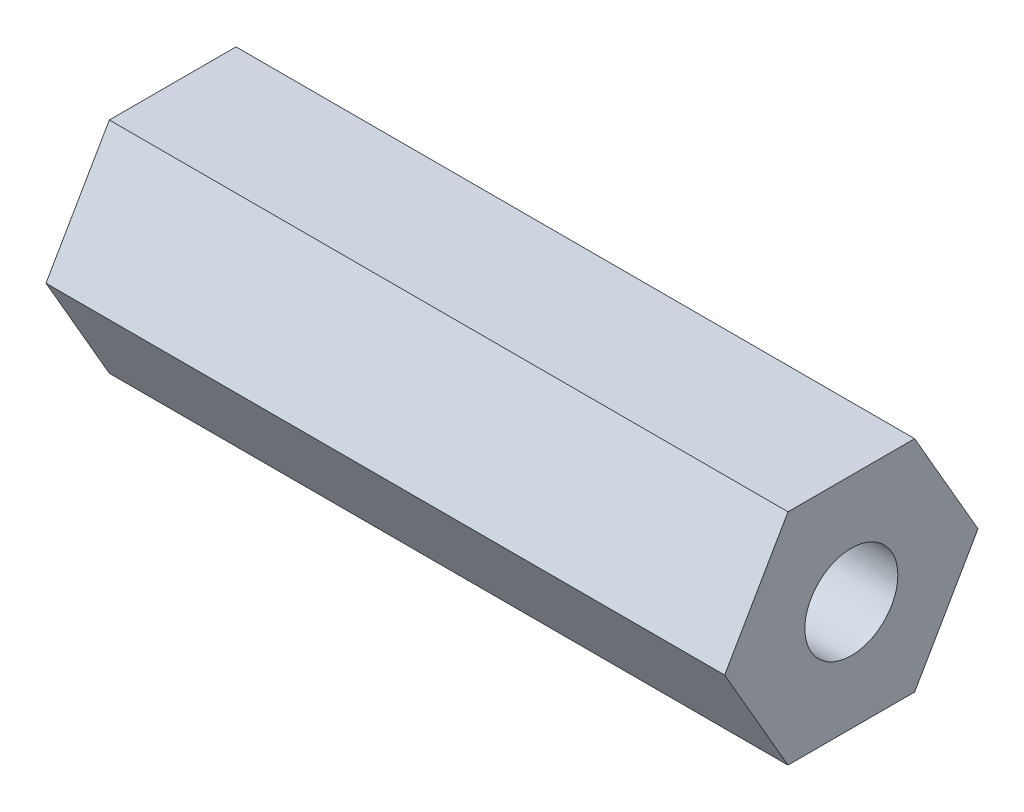
ISO-10303-21;
HEADER;
FILE_DESCRIPTION(('STEP AP214'),'2;1');
FILE_NAME('part.step','',(''),(''),'','','');
FILE_SCHEMA(('AUTOMOTIVE_DESIGN { 1 0 10303 214 1 1 1 1 }'));
ENDSEC;
DATA;
#1=APPLICATION_CONTEXT('core data for automotive mechanical design processes');
#2=APPLICATION_PROTOCOL_DEFINITION('international standard','automotive_design',2000,#1);
#3=PRODUCT_CONTEXT('',#1,'mechanical');
#4=PRODUCT('Part','Part','',(#3));
#5=PRODUCT_RELATED_PRODUCT_CATEGORY('part','',(#4));
#6=PRODUCT_DEFINITION_FORMATION('','',#4);
#7=PRODUCT_DEFINITION_CONTEXT('part definition',#1,'design');
#8=PRODUCT_DEFINITION('design','',#6,#7);
#9=PRODUCT_DEFINITION_SHAPE('','',#8);
#10=(LENGTH_UNIT() NAMED_UNIT(*) SI_UNIT(.MILLI.,.METRE.));
#11=(NAMED_UNIT(*) PLANE_ANGLE_UNIT() SI_UNIT($,.RADIAN.));
#12=(NAMED_UNIT(*) SI_UNIT($,.STERADIAN.) SOLID_ANGLE_UNIT());
#13=UNCERTAINTY_MEASURE_WITH_UNIT(LENGTH_MEASURE(1.E-05),#10,'distance_accuracy_value','');
#14=(GEOMETRIC_REPRESENTATION_CONTEXT(3) GLOBAL_UNCERTAINTY_ASSIGNED_CONTEXT((#13)) GLOBAL_UNIT_ASSIGNED_CONTEXT((#10,
#11,#12)) REPRESENTATION_CONTEXT('',''));
#15=CARTESIAN_POINT('',(0.,0.,0.));
#16=DIRECTION('',(0.,0.,1.));
#17=DIRECTION('',(1.,0.,0.));
#18=AXIS2_PLACEMENT_3D('',#15,#16,#17);
#19=CARTESIAN_POINT('',(38.1,0.,0.));
#20=DIRECTION('',(1.,0.,0.));
#21=DIRECTION('',(0.,1.,0.));
#22=AXIS2_PLACEMENT_3D('',#19,#20,#21);
#23=PLANE('',#22);
#24=CARTESIAN_POINT('',(38.1,0.,0.));
#25=DIRECTION('',(1.,0.,0.));
#26=DIRECTION('',(0.,0.,-1.));
#27=AXIS2_PLACEMENT_3D('',#24,#25,#26);
#28=CIRCLE('',#27,2.0193);
#29=CARTESIAN_POINT('',(38.1,0.,-2.0193));
#30=VERTEX_POINT('',#29);
#31=EDGE_CURVE('E129',#30,#30,#28,.T.);
#32=ORIENTED_EDGE('',*,*,#31,.F.);
#33=EDGE_LOOP('',(#32));
#34=FACE_BOUND('',#33,.T.);
#35=DIRECTION('',(0.,0.866025403784442,-0.5));
#36=VECTOR('',#35,1.);
#37=CARTESIAN_POINT('',(38.1,-4.7625,-2.74963065701564));
#38=LINE('',#37,#36);
#39=CARTESIAN_POINT('',(38.1,-4.7625,-2.74963065701564));
#40=VERTEX_POINT('',#39);
#41=CARTESIAN_POINT('',(38.1,0.,-5.49926131403117));
#42=VERTEX_POINT('',#41);
#43=EDGE_CURVE('E154',#40,#42,#38,.T.);
#44=ORIENTED_EDGE('',*,*,#43,.T.);
#45=DIRECTION('',(0.,0.866025403784438,0.5));
#46=VECTOR('',#45,1.);
#47=CARTESIAN_POINT('',(38.1,0.,-5.49926131403117));
#48=LINE('',#47,#46);
#49=CARTESIAN_POINT('',(38.1,4.7625,-2.74963065701557));
#50=VERTEX_POINT('',#49);
#51=EDGE_CURVE('E102',#42,#50,#48,.T.);
#52=ORIENTED_EDGE('',*,*,#51,.T.);
#53=DIRECTION('',(0.,0.,1.));
#54=VECTOR('',#53,1.);
#55=CARTESIAN_POINT('',(38.1,4.7625,-2.74963065701557));
#56=LINE('',#55,#54);
#57=CARTESIAN_POINT('',(38.1,4.7625,2.7496306570156));
#58=VERTEX_POINT('',#57);
#59=EDGE_CURVE('E143',#50,#58,#56,.T.);
#60=ORIENTED_EDGE('',*,*,#59,.T.);
#61=DIRECTION('',(0.,-0.866025403784442,0.5));
#62=VECTOR('',#61,1.);
#63=CARTESIAN_POINT('',(38.1,4.7625,2.7496306570156));
#64=LINE('',#63,#62);
#65=CARTESIAN_POINT('',(38.1,0.,5.49926131403117));
#66=VERTEX_POINT('',#65);
#67=EDGE_CURVE('E142',#58,#66,#64,.T.);
#68=ORIENTED_EDGE('',*,*,#67,.T.);
#69=DIRECTION('',(0.,-0.866025403784435,-0.500000000000007));
#70=VECTOR('',#69,1.);
#71=CARTESIAN_POINT('',(38.1,0.,5.49926131403117));
#72=LINE('',#71,#70);
#73=CARTESIAN_POINT('',(38.1,-4.7625,2.74963065701554));
#74=VERTEX_POINT('',#73);
#75=EDGE_CURVE('E55',#66,#74,#72,.T.);
#76=ORIENTED_EDGE('',*,*,#75,.T.);
#77=DIRECTION('',(0.,0.,-1.));
#78=VECTOR('',#77,1.);
#79=CARTESIAN_POINT('',(38.1,-4.7625,2.74963065701554));
#80=LINE('',#79,#78);
#81=EDGE_CURVE('E11',#74,#40,#80,.T.);
#82=ORIENTED_EDGE('',*,*,#81,.T.);
#83=EDGE_LOOP('',(#44,#52,#60,#68,#76,#82));
#84=FACE_BOUND('',#83,.T.);
#85=ADVANCED_FACE('F45',(#34,#84),#23,.T.);
#86=CARTESIAN_POINT('',(38.1,-4.7625,2.74963065701554));
#87=DIRECTION('',(0.,1.,0.));
#88=DIRECTION('',(0.,0.,-1.));
#89=AXIS2_PLACEMENT_3D('',#86,#87,#88);
#90=PLANE('',#89);
#91=DIRECTION('',(-1.,0.,0.));
#92=VECTOR('',#91,1.);
#93=CARTESIAN_POINT('',(38.1,-4.7625,2.74963065701554));
#94=LINE('',#93,#92);
#95=CARTESIAN_POINT('',(8.636,-4.76249999999999,2.74963065701555));
#96=VERTEX_POINT('',#95);
#97=EDGE_CURVE('E148',#74,#96,#94,.T.);
#98=ORIENTED_EDGE('',*,*,#97,.T.);
#99=DIRECTION('',(0.,0.,-1.));
#100=VECTOR('',#99,1.);
#101=CARTESIAN_POINT('',(8.636,-4.7625,2.74963065701554));
#102=LINE('',#101,#100);
#103=CARTESIAN_POINT('',(8.636,-4.7625,-2.74963065701564));
#104=VERTEX_POINT('',#103);
#105=EDGE_CURVE('E124',#96,#104,#102,.T.);
#106=ORIENTED_EDGE('',*,*,#105,.T.);
#107=DIRECTION('',(-1.,0.,0.));
#108=VECTOR('',#107,1.);
#109=CARTESIAN_POINT('',(38.1,-4.7625,-2.74963065701564));
#110=LINE('',#109,#108);
#111=EDGE_CURVE('E157',#40,#104,#110,.T.);
#112=ORIENTED_EDGE('',*,*,#111,.F.);
#113=ORIENTED_EDGE('',*,*,#81,.F.);
#114=EDGE_LOOP('',(#98,#106,#112,#113));
#115=FACE_BOUND('',#114,.T.);
#116=ADVANCED_FACE('F178',(#115),#90,.F.);
#117=CARTESIAN_POINT('',(38.1,0.,5.49926131403117));
#118=DIRECTION('',(0.,0.500000000000007,-0.866025403784435));
#119=DIRECTION('',(-1.,0.,0.));
#120=AXIS2_PLACEMENT_3D('',#117,#118,#119);
#121=PLANE('',#120);
#122=DIRECTION('',(-1.,0.,0.));
#123=VECTOR('',#122,1.);
#124=CARTESIAN_POINT('',(38.1,0.,5.49926131403117));
#125=LINE('',#124,#123);
#126=CARTESIAN_POINT('',(8.636,0.,5.49926131403121));
#127=VERTEX_POINT('',#126);
#128=EDGE_CURVE('E135',#66,#127,#125,.T.);
#129=ORIENTED_EDGE('',*,*,#128,.T.);
#130=DIRECTION('',(0.,-0.866025403784435,-0.500000000000007));
#131=VECTOR('',#130,1.);
#132=CARTESIAN_POINT('',(8.636,0.,5.49926131403117));
#133=LINE('',#132,#131);
#134=EDGE_CURVE('E118',#127,#96,#133,.T.);
#135=ORIENTED_EDGE('',*,*,#134,.T.);
#136=ORIENTED_EDGE('',*,*,#97,.F.);
#137=ORIENTED_EDGE('',*,*,#75,.F.);
#138=EDGE_LOOP('',(#129,#135,#136,#137));
#139=FACE_BOUND('',#138,.T.);
#140=ADVANCED_FACE('F47',(#139),#121,.F.);
#141=CARTESIAN_POINT('',(38.1,4.7625,2.7496306570156));
#142=DIRECTION('',(0.,-0.5,-0.866025403784442));
#143=DIRECTION('',(0.,-0.866025403784442,0.5));
#144=AXIS2_PLACEMENT_3D('',#141,#142,#143);
#145=PLANE('',#144);
#146=DIRECTION('',(-1.,0.,0.));
#147=VECTOR('',#146,1.);
#148=CARTESIAN_POINT('',(38.1,4.7625,2.7496306570156));
#149=LINE('',#148,#147);
#150=CARTESIAN_POINT('',(8.636,4.76249999999998,2.74963065701562));
#151=VERTEX_POINT('',#150);
#152=EDGE_CURVE('E137',#58,#151,#149,.T.);
#153=ORIENTED_EDGE('',*,*,#152,.T.);
#154=DIRECTION('',(0.,0.866025403784439,-0.499999999999998));
#155=VECTOR('',#154,1.);
#156=CARTESIAN_POINT('',(8.636,7.14374999999999,1.37481532850782));
#157=LINE('',#156,#155);
#158=EDGE_CURVE('E121',#127,#151,#157,.T.);
#159=ORIENTED_EDGE('',*,*,#158,.F.);
#160=ORIENTED_EDGE('',*,*,#128,.F.);
#161=ORIENTED_EDGE('',*,*,#67,.F.);
#162=EDGE_LOOP('',(#153,#159,#160,#161));
#163=FACE_BOUND('',#162,.T.);
#164=ADVANCED_FACE('F134',(#163),#145,.F.);
#165=CARTESIAN_POINT('',(38.1,4.7625,-2.74963065701557));
#166=DIRECTION('',(0.,-1.,0.));
#167=DIRECTION('',(0.,0.,-1.));
#168=AXIS2_PLACEMENT_3D('',#165,#166,#167);
#169=PLANE('',#168);
#170=DIRECTION('',(-1.,0.,0.));
#171=VECTOR('',#170,1.);
#172=CARTESIAN_POINT('',(38.1,4.7625,-2.74963065701557));
#173=LINE('',#172,#171);
#174=CARTESIAN_POINT('',(8.636,4.7625,-2.74963065701558));
#175=VERTEX_POINT('',#174);
#176=EDGE_CURVE('E173',#50,#175,#173,.T.);
#177=ORIENTED_EDGE('',*,*,#176,.T.);
#178=DIRECTION('',(0.,0.,1.));
#179=VECTOR('',#178,1.);
#180=CARTESIAN_POINT('',(8.636,4.7625,-2.74963065701557));
#181=LINE('',#180,#179);
#182=EDGE_CURVE('E182',#175,#151,#181,.T.);
#183=ORIENTED_EDGE('',*,*,#182,.T.);
#184=ORIENTED_EDGE('',*,*,#152,.F.);
#185=ORIENTED_EDGE('',*,*,#59,.F.);
#186=EDGE_LOOP('',(#177,#183,#184,#185));
#187=FACE_BOUND('',#186,.T.);
#188=ADVANCED_FACE('F228',(#187),#169,.F.);
#189=CARTESIAN_POINT('',(38.1,0.,-5.49926131403117));
#190=DIRECTION('',(0.,-0.5,0.866025403784438));
#191=DIRECTION('',(-1.,0.,0.));
#192=AXIS2_PLACEMENT_3D('',#189,#190,#191);
#193=PLANE('',#192);
#194=DIRECTION('',(-1.,0.,0.));
#195=VECTOR('',#194,1.);
#196=CARTESIAN_POINT('',(38.1,0.,-5.49926131403117));
#197=LINE('',#196,#195);
#198=CARTESIAN_POINT('',(8.636,0.,-5.49926131403117));
#199=VERTEX_POINT('',#198);
#200=EDGE_CURVE('E158',#42,#199,#197,.T.);
#201=ORIENTED_EDGE('',*,*,#200,.T.);
#202=DIRECTION('',(0.,0.866025403784438,0.5));
#203=VECTOR('',#202,1.);
#204=CARTESIAN_POINT('',(8.636,0.,-5.49926131403117));
#205=LINE('',#204,#203);
#206=EDGE_CURVE('E63',#199,#175,#205,.T.);
#207=ORIENTED_EDGE('',*,*,#206,.T.);
#208=ORIENTED_EDGE('',*,*,#176,.F.);
#209=ORIENTED_EDGE('',*,*,#51,.F.);
#210=EDGE_LOOP('',(#201,#207,#208,#209));
#211=FACE_BOUND('',#210,.T.);
#212=ADVANCED_FACE('F260',(#211),#193,.F.);
#213=CARTESIAN_POINT('',(38.1,-4.7625,-2.74963065701564));
#214=DIRECTION('',(0.,0.5,0.866025403784442));
#215=DIRECTION('',(1.,0.,0.));
#216=AXIS2_PLACEMENT_3D('',#213,#214,#215);
#217=PLANE('',#216);
#218=ORIENTED_EDGE('',*,*,#111,.T.);
#219=DIRECTION('',(0.,0.866025403784439,-0.499999999999999));
#220=VECTOR('',#219,1.);
#221=CARTESIAN_POINT('',(8.636,-4.7625,-2.74963065701564));
#222=LINE('',#221,#220);
#223=EDGE_CURVE('E186',#104,#199,#222,.T.);
#224=ORIENTED_EDGE('',*,*,#223,.T.);
#225=ORIENTED_EDGE('',*,*,#200,.F.);
#226=ORIENTED_EDGE('',*,*,#43,.F.);
#227=EDGE_LOOP('',(#218,#224,#225,#226));
#228=FACE_BOUND('',#227,.T.);
#229=ADVANCED_FACE('F185',(#228),#217,.F.);
#230=CARTESIAN_POINT('',(-38.1,0.,0.));
#231=DIRECTION('',(-1.,0.,0.));
#232=DIRECTION('',(0.,0.,1.));
#233=AXIS2_PLACEMENT_3D('',#230,#231,#232);
#234=CYLINDRICAL_SURFACE('',#233,2.0193);
#235=CARTESIAN_POINT('',(8.636,0.,0.));
#236=DIRECTION('',(1.,0.,0.));
#237=DIRECTION('',(0.,0.,-1.));
#238=AXIS2_PLACEMENT_3D('',#235,#236,#237);
#239=CIRCLE('',#238,2.0193);
#240=CARTESIAN_POINT('',(8.636,0.,-2.0193));
#241=VERTEX_POINT('',#240);
#242=EDGE_CURVE('E49',#241,#241,#239,.F.);
#243=ORIENTED_EDGE('',*,*,#242,.T.);
#244=EDGE_LOOP('',(#243));
#245=FACE_BOUND('',#244,.T.);
#246=ORIENTED_EDGE('',*,*,#31,.T.);
#247=EDGE_LOOP('',(#246));
#248=FACE_BOUND('',#247,.T.);
#249=ADVANCED_FACE('F244',(#245,#248),#234,.F.);
#250=CARTESIAN_POINT('',(8.636,1.19062500000001,-8.93629963530066));
#251=DIRECTION('',(1.,0.,0.));
#252=DIRECTION('',(0.,0.,-1.));
#253=AXIS2_PLACEMENT_3D('',#250,#251,#252);
#254=PLANE('',#253);
#255=ORIENTED_EDGE('',*,*,#242,.F.);
#256=EDGE_LOOP('',(#255));
#257=FACE_BOUND('',#256,.T.);
#258=ORIENTED_EDGE('',*,*,#158,.T.);
#259=ORIENTED_EDGE('',*,*,#182,.F.);
#260=ORIENTED_EDGE('',*,*,#206,.F.);
#261=ORIENTED_EDGE('',*,*,#223,.F.);
#262=ORIENTED_EDGE('',*,*,#105,.F.);
#263=ORIENTED_EDGE('',*,*,#134,.F.);
#264=EDGE_LOOP('',(#258,#259,#260,#261,#262,#263));
#265=FACE_BOUND('',#264,.T.);
#266=ADVANCED_FACE('F120',(#257,#265),#254,.F.);
#267=CLOSED_SHELL('',(#85,#116,#140,#164,#188,#212,#229,#249,#266));
#268=MANIFOLD_SOLID_BREP('B2',#267);
#269=ADVANCED_BREP_SHAPE_REPRESENTATION('',(#18,#268),#14);
#270=SHAPE_DEFINITION_REPRESENTATION(#9,#269);
ENDSEC;
END-ISO-10303-21;
